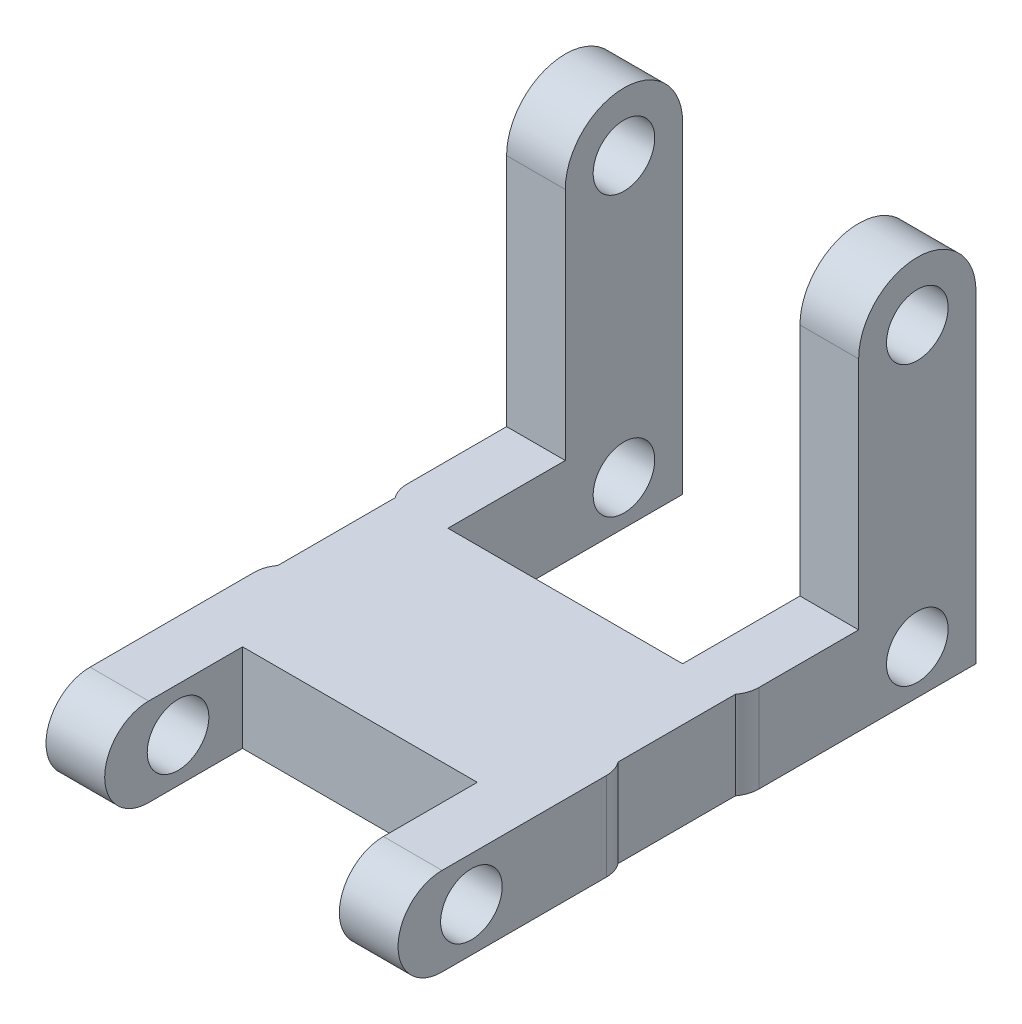
ISO-10303-21;
HEADER;
FILE_DESCRIPTION(('STEP AP214'),'2;1');
FILE_NAME('part.step','',(''),(''),'','','');
FILE_SCHEMA(('AUTOMOTIVE_DESIGN { 1 0 10303 214 1 1 1 1 }'));
ENDSEC;
DATA;
#1=APPLICATION_CONTEXT('core data for automotive mechanical design processes');
#2=APPLICATION_PROTOCOL_DEFINITION('international standard','automotive_design',2000,#1);
#3=PRODUCT_CONTEXT('',#1,'mechanical');
#4=PRODUCT('Part','Part','',(#3));
#5=PRODUCT_RELATED_PRODUCT_CATEGORY('part','',(#4));
#6=PRODUCT_DEFINITION_FORMATION('','',#4);
#7=PRODUCT_DEFINITION_CONTEXT('part definition',#1,'design');
#8=PRODUCT_DEFINITION('design','',#6,#7);
#9=PRODUCT_DEFINITION_SHAPE('','',#8);
#10=(LENGTH_UNIT() NAMED_UNIT(*) SI_UNIT(.MILLI.,.METRE.));
#11=(NAMED_UNIT(*) PLANE_ANGLE_UNIT() SI_UNIT($,.RADIAN.));
#12=(NAMED_UNIT(*) SI_UNIT($,.STERADIAN.) SOLID_ANGLE_UNIT());
#13=UNCERTAINTY_MEASURE_WITH_UNIT(LENGTH_MEASURE(1.E-05),#10,'distance_accuracy_value','');
#14=(GEOMETRIC_REPRESENTATION_CONTEXT(3) GLOBAL_UNCERTAINTY_ASSIGNED_CONTEXT((#13)) GLOBAL_UNIT_ASSIGNED_CONTEXT((#10,
#11,#12)) REPRESENTATION_CONTEXT('',''));
#15=CARTESIAN_POINT('',(0.,0.,0.));
#16=DIRECTION('',(0.,0.,1.));
#17=DIRECTION('',(1.,0.,0.));
#18=AXIS2_PLACEMENT_3D('',#15,#16,#17);
#19=CARTESIAN_POINT('',(-4.,3.,8.7));
#20=DIRECTION('',(-1.,0.,0.));
#21=DIRECTION('',(0.,0.,1.));
#22=AXIS2_PLACEMENT_3D('',#19,#20,#21);
#23=PLANE('',#22);
#24=CARTESIAN_POINT('',(-4.,1.5,5.2));
#25=DIRECTION('',(-1.,0.,0.));
#26=DIRECTION('',(0.,0.,1.));
#27=AXIS2_PLACEMENT_3D('',#24,#25,#26);
#28=CIRCLE('',#27,1.05);
#29=CARTESIAN_POINT('',(-4.,1.5,6.25));
#30=VERTEX_POINT('',#29);
#31=EDGE_CURVE('E282',#30,#30,#28,.T.);
#32=ORIENTED_EDGE('',*,*,#31,.T.);
#33=EDGE_LOOP('',(#32));
#34=FACE_BOUND('',#33,.T.);
#35=CARTESIAN_POINT('',(-4.,1.5,6.2));
#36=DIRECTION('',(-1.,0.,0.));
#37=DIRECTION('',(0.,0.,1.));
#38=AXIS2_PLACEMENT_3D('',#35,#36,#37);
#39=CIRCLE('',#38,1.5);
#40=CARTESIAN_POINT('',(-4.,0.,6.2));
#41=VERTEX_POINT('',#40);
#42=CARTESIAN_POINT('',(-4.,3.,6.2));
#43=VERTEX_POINT('',#42);
#44=EDGE_CURVE('E298',#41,#43,#39,.T.);
#45=ORIENTED_EDGE('',*,*,#44,.F.);
#46=DIRECTION('',(0.,0.,-1.));
#47=VECTOR('',#46,1.);
#48=CARTESIAN_POINT('',(-4.,0.,8.7));
#49=LINE('',#48,#47);
#50=CARTESIAN_POINT('',(-4.,0.,3.));
#51=VERTEX_POINT('',#50);
#52=EDGE_CURVE('E300',#41,#51,#49,.T.);
#53=ORIENTED_EDGE('',*,*,#52,.T.);
#54=DIRECTION('',(0.,-1.,0.));
#55=VECTOR('',#54,1.);
#56=CARTESIAN_POINT('',(-4.,3.,3.));
#57=LINE('',#56,#55);
#58=CARTESIAN_POINT('',(-4.,3.,3.));
#59=VERTEX_POINT('',#58);
#60=EDGE_CURVE('E327',#59,#51,#57,.T.);
#61=ORIENTED_EDGE('',*,*,#60,.F.);
#62=DIRECTION('',(0.,0.,-1.));
#63=VECTOR('',#62,1.);
#64=CARTESIAN_POINT('',(-4.,3.,8.7));
#65=LINE('',#64,#63);
#66=EDGE_CURVE('E301',#43,#59,#65,.T.);
#67=ORIENTED_EDGE('',*,*,#66,.F.);
#68=EDGE_LOOP('',(#45,#53,#61,#67));
#69=FACE_BOUND('',#68,.T.);
#70=ADVANCED_FACE('F35',(#34,#69),#23,.F.);
#71=CARTESIAN_POINT('',(4.,3.,3.));
#72=DIRECTION('',(1.,0.,0.));
#73=DIRECTION('',(0.,0.,-1.));
#74=AXIS2_PLACEMENT_3D('',#71,#72,#73);
#75=PLANE('',#74);
#76=CARTESIAN_POINT('',(4.,1.5,5.2));
#77=DIRECTION('',(1.,0.,0.));
#78=DIRECTION('',(0.,0.,-1.));
#79=AXIS2_PLACEMENT_3D('',#76,#77,#78);
#80=CIRCLE('',#79,1.05);
#81=CARTESIAN_POINT('',(4.,1.5,4.15));
#82=VERTEX_POINT('',#81);
#83=EDGE_CURVE('E277',#82,#82,#80,.T.);
#84=ORIENTED_EDGE('',*,*,#83,.T.);
#85=EDGE_LOOP('',(#84));
#86=FACE_BOUND('',#85,.T.);
#87=CARTESIAN_POINT('',(4.,1.5,6.2));
#88=DIRECTION('',(1.,0.,0.));
#89=DIRECTION('',(0.,0.,-1.));
#90=AXIS2_PLACEMENT_3D('',#87,#88,#89);
#91=CIRCLE('',#90,1.5);
#92=CARTESIAN_POINT('',(4.,3.,6.2));
#93=VERTEX_POINT('',#92);
#94=CARTESIAN_POINT('',(4.,0.,6.2));
#95=VERTEX_POINT('',#94);
#96=EDGE_CURVE('E294',#93,#95,#91,.T.);
#97=ORIENTED_EDGE('',*,*,#96,.F.);
#98=DIRECTION('',(0.,0.,1.));
#99=VECTOR('',#98,1.);
#100=CARTESIAN_POINT('',(4.,3.,3.));
#101=LINE('',#100,#99);
#102=CARTESIAN_POINT('',(4.,3.,3.));
#103=VERTEX_POINT('',#102);
#104=EDGE_CURVE('E306',#103,#93,#101,.T.);
#105=ORIENTED_EDGE('',*,*,#104,.F.);
#106=DIRECTION('',(0.,-1.,0.));
#107=VECTOR('',#106,1.);
#108=CARTESIAN_POINT('',(4.,3.,3.));
#109=LINE('',#108,#107);
#110=CARTESIAN_POINT('',(4.,0.,3.));
#111=VERTEX_POINT('',#110);
#112=EDGE_CURVE('E314',#103,#111,#109,.T.);
#113=ORIENTED_EDGE('',*,*,#112,.T.);
#114=DIRECTION('',(0.,0.,1.));
#115=VECTOR('',#114,1.);
#116=CARTESIAN_POINT('',(4.,0.,3.));
#117=LINE('',#116,#115);
#118=EDGE_CURVE('E318',#111,#95,#117,.T.);
#119=ORIENTED_EDGE('',*,*,#118,.T.);
#120=EDGE_LOOP('',(#97,#105,#113,#119));
#121=FACE_BOUND('',#120,.T.);
#122=ADVANCED_FACE('F453',(#86,#121),#75,.F.);
#123=CARTESIAN_POINT('',(6.,3.,8.7));
#124=DIRECTION('',(-1.,0.,0.));
#125=DIRECTION('',(0.,0.,1.));
#126=AXIS2_PLACEMENT_3D('',#123,#124,#125);
#127=PLANE('',#126);
#128=CARTESIAN_POINT('',(6.,1.5,5.2));
#129=DIRECTION('',(-1.,0.,0.));
#130=DIRECTION('',(0.,0.,1.));
#131=AXIS2_PLACEMENT_3D('',#128,#129,#130);
#132=CIRCLE('',#131,1.05);
#133=CARTESIAN_POINT('',(6.,1.5,6.25));
#134=VERTEX_POINT('',#133);
#135=EDGE_CURVE('E274',#134,#134,#132,.T.);
#136=ORIENTED_EDGE('',*,*,#135,.T.);
#137=EDGE_LOOP('',(#136));
#138=FACE_BOUND('',#137,.T.);
#139=DIRECTION('',(0.,0.,-1.));
#140=VECTOR('',#139,1.);
#141=CARTESIAN_POINT('',(6.,0.,8.7));
#142=LINE('',#141,#140);
#143=CARTESIAN_POINT('',(6.00000000000001,0.,6.2));
#144=VERTEX_POINT('',#143);
#145=CARTESIAN_POINT('',(6.,0.,0.599999999999996));
#146=VERTEX_POINT('',#145);
#147=EDGE_CURVE('E321',#144,#146,#142,.T.);
#148=ORIENTED_EDGE('',*,*,#147,.T.);
#149=DIRECTION('',(0.,-1.,0.));
#150=VECTOR('',#149,1.);
#151=CARTESIAN_POINT('',(6.,3.,0.599999999999996));
#152=LINE('',#151,#150);
#153=CARTESIAN_POINT('',(6.,3.,0.599999999999996));
#154=VERTEX_POINT('',#153);
#155=EDGE_CURVE('E341',#146,#154,#152,.F.);
#156=ORIENTED_EDGE('',*,*,#155,.T.);
#157=DIRECTION('',(0.,0.,-1.));
#158=VECTOR('',#157,1.);
#159=CARTESIAN_POINT('',(6.,3.,8.7));
#160=LINE('',#159,#158);
#161=CARTESIAN_POINT('',(6.00000000000001,3.,6.2));
#162=VERTEX_POINT('',#161);
#163=EDGE_CURVE('E309',#162,#154,#160,.T.);
#164=ORIENTED_EDGE('',*,*,#163,.F.);
#165=CARTESIAN_POINT('',(6.00000000000001,1.5,6.2));
#166=DIRECTION('',(-1.,0.,0.));
#167=DIRECTION('',(0.,0.,1.));
#168=AXIS2_PLACEMENT_3D('',#165,#166,#167);
#169=CIRCLE('',#168,1.5);
#170=EDGE_CURVE('E286',#144,#162,#169,.T.);
#171=ORIENTED_EDGE('',*,*,#170,.F.);
#172=EDGE_LOOP('',(#148,#156,#164,#171));
#173=FACE_BOUND('',#172,.T.);
#174=ADVANCED_FACE('F459',(#138,#173),#127,.F.);
#175=CARTESIAN_POINT('',(-6.,3.,0.));
#176=DIRECTION('',(1.,0.,0.));
#177=DIRECTION('',(0.,0.,-1.));
#178=AXIS2_PLACEMENT_3D('',#175,#176,#177);
#179=PLANE('',#178);
#180=CARTESIAN_POINT('',(-6.,1.5,5.2));
#181=DIRECTION('',(-1.,0.,0.));
#182=DIRECTION('',(0.,0.,1.));
#183=AXIS2_PLACEMENT_3D('',#180,#181,#182);
#184=CIRCLE('',#183,1.05);
#185=CARTESIAN_POINT('',(-6.,1.5,6.25));
#186=VERTEX_POINT('',#185);
#187=EDGE_CURVE('E273',#186,#186,#184,.T.);
#188=ORIENTED_EDGE('',*,*,#187,.F.);
#189=EDGE_LOOP('',(#188));
#190=FACE_BOUND('',#189,.T.);
#191=DIRECTION('',(0.,0.,1.));
#192=VECTOR('',#191,1.);
#193=CARTESIAN_POINT('',(-6.,3.,0.));
#194=LINE('',#193,#192);
#195=CARTESIAN_POINT('',(-6.,3.,0.6));
#196=VERTEX_POINT('',#195);
#197=CARTESIAN_POINT('',(-6.,3.,6.2));
#198=VERTEX_POINT('',#197);
#199=EDGE_CURVE('E312',#196,#198,#194,.T.);
#200=ORIENTED_EDGE('',*,*,#199,.F.);
#201=DIRECTION('',(0.,1.,0.));
#202=VECTOR('',#201,1.);
#203=CARTESIAN_POINT('',(-6.,3.,0.6));
#204=LINE('',#203,#202);
#205=CARTESIAN_POINT('',(-6.,0.,0.6));
#206=VERTEX_POINT('',#205);
#207=EDGE_CURVE('E347',#196,#206,#204,.F.);
#208=ORIENTED_EDGE('',*,*,#207,.T.);
#209=DIRECTION('',(0.,0.,1.));
#210=VECTOR('',#209,1.);
#211=CARTESIAN_POINT('',(-6.,0.,0.));
#212=LINE('',#211,#210);
#213=CARTESIAN_POINT('',(-6.,0.,6.2));
#214=VERTEX_POINT('',#213);
#215=EDGE_CURVE('E304',#206,#214,#212,.T.);
#216=ORIENTED_EDGE('',*,*,#215,.T.);
#217=CARTESIAN_POINT('',(-6.,1.5,6.2));
#218=DIRECTION('',(-1.,0.,0.));
#219=DIRECTION('',(0.,0.,1.));
#220=AXIS2_PLACEMENT_3D('',#217,#218,#219);
#221=CIRCLE('',#220,1.5);
#222=EDGE_CURVE('E285',#214,#198,#221,.T.);
#223=ORIENTED_EDGE('',*,*,#222,.T.);
#224=EDGE_LOOP('',(#200,#208,#216,#223));
#225=FACE_BOUND('',#224,.T.);
#226=ADVANCED_FACE('F482',(#190,#225),#179,.F.);
#227=CARTESIAN_POINT('',(0.,3.,0.));
#228=DIRECTION('',(0.,-1.,0.));
#229=DIRECTION('',(0.,0.,-1.));
#230=AXIS2_PLACEMENT_3D('',#227,#228,#229);
#231=PLANE('',#230);
#232=DIRECTION('',(0.,0.,1.));
#233=VECTOR('',#232,1.);
#234=CARTESIAN_POINT('',(-6.,3.,-12.));
#235=LINE('',#234,#233);
#236=CARTESIAN_POINT('',(-6.,3.,-8.));
#237=VERTEX_POINT('',#236);
#238=CARTESIAN_POINT('',(-6.,3.,-4.6));
#239=VERTEX_POINT('',#238);
#240=EDGE_CURVE('E263',#237,#239,#235,.T.);
#241=ORIENTED_EDGE('',*,*,#240,.T.);
#242=CARTESIAN_POINT('',(-5.,3.,-4.6));
#243=DIRECTION('',(0.,-1.,0.));
#244=DIRECTION('',(0.,0.,-1.));
#245=AXIS2_PLACEMENT_3D('',#242,#243,#244);
#246=CIRCLE('',#245,1.);
#247=CARTESIAN_POINT('',(-5.8,3.,-4.));
#248=VERTEX_POINT('',#247);
#249=EDGE_CURVE('E357',#239,#248,#246,.F.);
#250=ORIENTED_EDGE('',*,*,#249,.T.);
#251=DIRECTION('',(0.,0.,-1.));
#252=VECTOR('',#251,1.);
#253=CARTESIAN_POINT('',(-5.8,3.,11.9816526406001));
#254=LINE('',#253,#252);
#255=CARTESIAN_POINT('',(-5.8,3.,0.));
#256=VERTEX_POINT('',#255);
#257=EDGE_CURVE('E376',#256,#248,#254,.T.);
#258=ORIENTED_EDGE('',*,*,#257,.F.);
#259=CARTESIAN_POINT('',(-5.,3.,0.6));
#260=DIRECTION('',(0.,-1.,0.));
#261=DIRECTION('',(0.,0.,-1.));
#262=AXIS2_PLACEMENT_3D('',#259,#260,#261);
#263=CIRCLE('',#262,1.);
#264=EDGE_CURVE('E343',#256,#196,#263,.F.);
#265=ORIENTED_EDGE('',*,*,#264,.T.);
#266=ORIENTED_EDGE('',*,*,#199,.T.);
#267=DIRECTION('',(-1.,0.,0.));
#268=VECTOR('',#267,1.);
#269=CARTESIAN_POINT('',(6.00000000000001,3.,6.2));
#270=LINE('',#269,#268);
#271=EDGE_CURVE('E288',#43,#198,#270,.T.);
#272=ORIENTED_EDGE('',*,*,#271,.F.);
#273=ORIENTED_EDGE('',*,*,#66,.T.);
#274=DIRECTION('',(1.,0.,0.));
#275=VECTOR('',#274,1.);
#276=CARTESIAN_POINT('',(-4.,3.,3.));
#277=LINE('',#276,#275);
#278=EDGE_CURVE('E303',#59,#103,#277,.T.);
#279=ORIENTED_EDGE('',*,*,#278,.T.);
#280=ORIENTED_EDGE('',*,*,#104,.T.);
#281=EDGE_CURVE('E295',#162,#93,#270,.T.);
#282=ORIENTED_EDGE('',*,*,#281,.F.);
#283=ORIENTED_EDGE('',*,*,#163,.T.);
#284=CARTESIAN_POINT('',(5.,3.,0.599999999999996));
#285=DIRECTION('',(0.,-1.,0.));
#286=DIRECTION('',(0.,0.,-1.));
#287=AXIS2_PLACEMENT_3D('',#284,#285,#286);
#288=CIRCLE('',#287,1.);
#289=CARTESIAN_POINT('',(5.8,3.,0.));
#290=VERTEX_POINT('',#289);
#291=EDGE_CURVE('E345',#154,#290,#288,.F.);
#292=ORIENTED_EDGE('',*,*,#291,.T.);
#293=DIRECTION('',(0.,0.,-1.));
#294=VECTOR('',#293,1.);
#295=CARTESIAN_POINT('',(5.8,3.,11.9816526406001));
#296=LINE('',#295,#294);
#297=CARTESIAN_POINT('',(5.8,3.,-4.));
#298=VERTEX_POINT('',#297);
#299=EDGE_CURVE('E383',#290,#298,#296,.T.);
#300=ORIENTED_EDGE('',*,*,#299,.T.);
#301=CARTESIAN_POINT('',(5.00000000000001,3.,-4.60000000000001));
#302=DIRECTION('',(0.,-1.,0.));
#303=DIRECTION('',(0.,0.,-1.));
#304=AXIS2_PLACEMENT_3D('',#301,#302,#303);
#305=CIRCLE('',#304,1.);
#306=CARTESIAN_POINT('',(6.,3.,-4.60000000000001));
#307=VERTEX_POINT('',#306);
#308=EDGE_CURVE('E57',#298,#307,#305,.F.);
#309=ORIENTED_EDGE('',*,*,#308,.T.);
#310=DIRECTION('',(0.,0.,1.));
#311=VECTOR('',#310,1.);
#312=CARTESIAN_POINT('',(6.,3.,-12.));
#313=LINE('',#312,#311);
#314=CARTESIAN_POINT('',(6.,3.,-8.));
#315=VERTEX_POINT('',#314);
#316=EDGE_CURVE('E271',#315,#307,#313,.T.);
#317=ORIENTED_EDGE('',*,*,#316,.F.);
#318=DIRECTION('',(1.,0.,0.));
#319=VECTOR('',#318,1.);
#320=CARTESIAN_POINT('',(4.,3.,-8.));
#321=LINE('',#320,#319);
#322=CARTESIAN_POINT('',(4.,3.,-8.));
#323=VERTEX_POINT('',#322);
#324=EDGE_CURVE('E232',#323,#315,#321,.T.);
#325=ORIENTED_EDGE('',*,*,#324,.F.);
#326=DIRECTION('',(0.,0.,-1.));
#327=VECTOR('',#326,1.);
#328=CARTESIAN_POINT('',(4.,3.,-4.));
#329=LINE('',#328,#327);
#330=CARTESIAN_POINT('',(4.,3.,-4.));
#331=VERTEX_POINT('',#330);
#332=EDGE_CURVE('E428',#331,#323,#329,.T.);
#333=ORIENTED_EDGE('',*,*,#332,.F.);
#334=DIRECTION('',(1.,0.,0.));
#335=VECTOR('',#334,1.);
#336=CARTESIAN_POINT('',(-4.,3.,-4.));
#337=LINE('',#336,#335);
#338=CARTESIAN_POINT('',(-4.,3.,-4.));
#339=VERTEX_POINT('',#338);
#340=EDGE_CURVE('E205',#339,#331,#337,.T.);
#341=ORIENTED_EDGE('',*,*,#340,.F.);
#342=DIRECTION('',(0.,0.,1.));
#343=VECTOR('',#342,1.);
#344=CARTESIAN_POINT('',(-4.,3.,-8.));
#345=LINE('',#344,#343);
#346=CARTESIAN_POINT('',(-4.,3.,-8.));
#347=VERTEX_POINT('',#346);
#348=EDGE_CURVE('E197',#347,#339,#345,.T.);
#349=ORIENTED_EDGE('',*,*,#348,.F.);
#350=DIRECTION('',(-1.,0.,0.));
#351=VECTOR('',#350,1.);
#352=CARTESIAN_POINT('',(-4.,3.,-8.));
#353=LINE('',#352,#351);
#354=EDGE_CURVE('E201',#347,#237,#353,.T.);
#355=ORIENTED_EDGE('',*,*,#354,.T.);
#356=EDGE_LOOP('',(#241,#250,#258,#265,#266,#272,#273,#279,#280,#282,#283,#292,#300,#309,#317,
#325,#333,#341,#349,#355));
#357=FACE_BOUND('',#356,.T.);
#358=ADVANCED_FACE('F200',(#357),#231,.F.);
#359=CARTESIAN_POINT('',(0.,0.,0.));
#360=DIRECTION('',(0.,-1.,0.));
#361=DIRECTION('',(0.,0.,-1.));
#362=AXIS2_PLACEMENT_3D('',#359,#360,#361);
#363=PLANE('',#362);
#364=DIRECTION('',(0.,0.,-1.));
#365=VECTOR('',#364,1.);
#366=CARTESIAN_POINT('',(-5.8,0.,11.9816526406001));
#367=LINE('',#366,#365);
#368=CARTESIAN_POINT('',(-5.8,0.,0.));
#369=VERTEX_POINT('',#368);
#370=CARTESIAN_POINT('',(-5.8,0.,-4.));
#371=VERTEX_POINT('',#370);
#372=EDGE_CURVE('E366',#369,#371,#367,.T.);
#373=ORIENTED_EDGE('',*,*,#372,.T.);
#374=CARTESIAN_POINT('',(-5.,0.,-4.6));
#375=DIRECTION('',(0.,-1.,0.));
#376=DIRECTION('',(0.,0.,-1.));
#377=AXIS2_PLACEMENT_3D('',#374,#375,#376);
#378=CIRCLE('',#377,1.);
#379=CARTESIAN_POINT('',(-6.,0.,-4.6));
#380=VERTEX_POINT('',#379);
#381=EDGE_CURVE('E43',#371,#380,#378,.T.);
#382=ORIENTED_EDGE('',*,*,#381,.T.);
#383=DIRECTION('',(0.,0.,1.));
#384=VECTOR('',#383,1.);
#385=CARTESIAN_POINT('',(-6.,0.,-12.));
#386=LINE('',#385,#384);
#387=CARTESIAN_POINT('',(-6.,0.,-12.));
#388=VERTEX_POINT('',#387);
#389=EDGE_CURVE('E265',#388,#380,#386,.T.);
#390=ORIENTED_EDGE('',*,*,#389,.F.);
#391=DIRECTION('',(-1.,0.,0.));
#392=VECTOR('',#391,1.);
#393=CARTESIAN_POINT('',(6.00000000000001,0.,-12.));
#394=LINE('',#393,#392);
#395=CARTESIAN_POINT('',(-4.,0.,-12.));
#396=VERTEX_POINT('',#395);
#397=EDGE_CURVE('E257',#396,#388,#394,.T.);
#398=ORIENTED_EDGE('',*,*,#397,.F.);
#399=DIRECTION('',(0.,0.,1.));
#400=VECTOR('',#399,1.);
#401=CARTESIAN_POINT('',(-4.,0.,-12.));
#402=LINE('',#401,#400);
#403=CARTESIAN_POINT('',(-4.,0.,-4.));
#404=VERTEX_POINT('',#403);
#405=EDGE_CURVE('E247',#396,#404,#402,.T.);
#406=ORIENTED_EDGE('',*,*,#405,.T.);
#407=DIRECTION('',(-1.,0.,0.));
#408=VECTOR('',#407,1.);
#409=CARTESIAN_POINT('',(0.,0.,-4.));
#410=LINE('',#409,#408);
#411=CARTESIAN_POINT('',(4.,0.,-4.));
#412=VERTEX_POINT('',#411);
#413=EDGE_CURVE('E350',#412,#404,#410,.T.);
#414=ORIENTED_EDGE('',*,*,#413,.F.);
#415=DIRECTION('',(0.,0.,-1.));
#416=VECTOR('',#415,1.);
#417=CARTESIAN_POINT('',(4.,0.,-12.));
#418=LINE('',#417,#416);
#419=CARTESIAN_POINT('',(4.,0.,-12.));
#420=VERTEX_POINT('',#419);
#421=EDGE_CURVE('E243',#412,#420,#418,.T.);
#422=ORIENTED_EDGE('',*,*,#421,.T.);
#423=CARTESIAN_POINT('',(6.00000000000001,0.,-12.));
#424=VERTEX_POINT('',#423);
#425=EDGE_CURVE('E258',#424,#420,#394,.T.);
#426=ORIENTED_EDGE('',*,*,#425,.F.);
#427=DIRECTION('',(0.,0.,1.));
#428=VECTOR('',#427,1.);
#429=CARTESIAN_POINT('',(6.00000000000001,0.,-12.));
#430=LINE('',#429,#428);
#431=CARTESIAN_POINT('',(6.00000000000001,0.,-4.60000000000001));
#432=VERTEX_POINT('',#431);
#433=EDGE_CURVE('E268',#424,#432,#430,.T.);
#434=ORIENTED_EDGE('',*,*,#433,.T.);
#435=CARTESIAN_POINT('',(5.00000000000001,0.,-4.60000000000001));
#436=DIRECTION('',(0.,-1.,0.));
#437=DIRECTION('',(0.,0.,-1.));
#438=AXIS2_PLACEMENT_3D('',#435,#436,#437);
#439=CIRCLE('',#438,1.);
#440=CARTESIAN_POINT('',(5.8,0.,-4.));
#441=VERTEX_POINT('',#440);
#442=EDGE_CURVE('E50',#432,#441,#439,.T.);
#443=ORIENTED_EDGE('',*,*,#442,.T.);
#444=DIRECTION('',(0.,0.,-1.));
#445=VECTOR('',#444,1.);
#446=CARTESIAN_POINT('',(5.8,0.,11.9816526406001));
#447=LINE('',#446,#445);
#448=CARTESIAN_POINT('',(5.8,0.,0.));
#449=VERTEX_POINT('',#448);
#450=EDGE_CURVE('E391',#449,#441,#447,.T.);
#451=ORIENTED_EDGE('',*,*,#450,.F.);
#452=CARTESIAN_POINT('',(5.,0.,0.599999999999996));
#453=DIRECTION('',(0.,-1.,0.));
#454=DIRECTION('',(0.,0.,-1.));
#455=AXIS2_PLACEMENT_3D('',#452,#453,#454);
#456=CIRCLE('',#455,1.);
#457=EDGE_CURVE('E339',#449,#146,#456,.T.);
#458=ORIENTED_EDGE('',*,*,#457,.T.);
#459=ORIENTED_EDGE('',*,*,#147,.F.);
#460=DIRECTION('',(-1.,0.,0.));
#461=VECTOR('',#460,1.);
#462=CARTESIAN_POINT('',(6.00000000000001,0.,6.2));
#463=LINE('',#462,#461);
#464=EDGE_CURVE('E291',#144,#95,#463,.T.);
#465=ORIENTED_EDGE('',*,*,#464,.T.);
#466=ORIENTED_EDGE('',*,*,#118,.F.);
#467=DIRECTION('',(1.,0.,0.));
#468=VECTOR('',#467,1.);
#469=CARTESIAN_POINT('',(-4.,0.,3.));
#470=LINE('',#469,#468);
#471=EDGE_CURVE('E316',#51,#111,#470,.T.);
#472=ORIENTED_EDGE('',*,*,#471,.F.);
#473=ORIENTED_EDGE('',*,*,#52,.F.);
#474=DIRECTION('',(-1.,0.,0.));
#475=VECTOR('',#474,1.);
#476=CARTESIAN_POINT('',(6.00000000000001,0.,6.2));
#477=LINE('',#476,#475);
#478=EDGE_CURVE('E330',#41,#214,#477,.T.);
#479=ORIENTED_EDGE('',*,*,#478,.T.);
#480=ORIENTED_EDGE('',*,*,#215,.F.);
#481=CARTESIAN_POINT('',(-5.,0.,0.6));
#482=DIRECTION('',(0.,-1.,0.));
#483=DIRECTION('',(0.,0.,-1.));
#484=AXIS2_PLACEMENT_3D('',#481,#482,#483);
#485=CIRCLE('',#484,1.);
#486=EDGE_CURVE('E333',#206,#369,#485,.T.);
#487=ORIENTED_EDGE('',*,*,#486,.T.);
#488=EDGE_LOOP('',(#373,#382,#390,#398,#406,#414,#422,#426,#434,#443,#451,#458,#459,#465,#466,
#472,#473,#479,#480,#487));
#489=FACE_BOUND('',#488,.T.);
#490=ADVANCED_FACE('F362',(#489),#363,.T.);
#491=CARTESIAN_POINT('',(-4.,3.,3.));
#492=DIRECTION('',(0.,0.,-1.));
#493=DIRECTION('',(-1.,0.,0.));
#494=AXIS2_PLACEMENT_3D('',#491,#492,#493);
#495=PLANE('',#494);
#496=ORIENTED_EDGE('',*,*,#471,.T.);
#497=ORIENTED_EDGE('',*,*,#112,.F.);
#498=ORIENTED_EDGE('',*,*,#278,.F.);
#499=ORIENTED_EDGE('',*,*,#60,.T.);
#500=EDGE_LOOP('',(#496,#497,#498,#499));
#501=FACE_BOUND('',#500,.T.);
#502=ADVANCED_FACE('F465',(#501),#495,.F.);
#503=CARTESIAN_POINT('',(6.00000000000001,1.5,6.2));
#504=DIRECTION('',(-1.,0.,0.));
#505=DIRECTION('',(0.,0.,1.));
#506=AXIS2_PLACEMENT_3D('',#503,#504,#505);
#507=CYLINDRICAL_SURFACE('',#506,1.5);
#508=ORIENTED_EDGE('',*,*,#44,.T.);
#509=ORIENTED_EDGE('',*,*,#271,.T.);
#510=ORIENTED_EDGE('',*,*,#222,.F.);
#511=ORIENTED_EDGE('',*,*,#478,.F.);
#512=EDGE_LOOP('',(#508,#509,#510,#511));
#513=FACE_BOUND('',#512,.T.);
#514=ADVANCED_FACE('F486',(#513),#507,.T.);
#515=ORIENTED_EDGE('',*,*,#96,.T.);
#516=ORIENTED_EDGE('',*,*,#464,.F.);
#517=ORIENTED_EDGE('',*,*,#170,.T.);
#518=ORIENTED_EDGE('',*,*,#281,.T.);
#519=EDGE_LOOP('',(#515,#516,#517,#518));
#520=FACE_BOUND('',#519,.T.);
#521=ADVANCED_FACE('F507',(#520),#507,.T.);
#522=CARTESIAN_POINT('',(6.,1.5,5.2));
#523=DIRECTION('',(-1.,0.,0.));
#524=DIRECTION('',(0.,0.,1.));
#525=AXIS2_PLACEMENT_3D('',#522,#523,#524);
#526=CYLINDRICAL_SURFACE('',#525,1.05);
#527=ORIENTED_EDGE('',*,*,#187,.T.);
#528=EDGE_LOOP('',(#527));
#529=FACE_BOUND('',#528,.T.);
#530=ORIENTED_EDGE('',*,*,#31,.F.);
#531=EDGE_LOOP('',(#530));
#532=FACE_BOUND('',#531,.T.);
#533=ADVANCED_FACE('F509',(#529,#532),#526,.F.);
#534=ORIENTED_EDGE('',*,*,#135,.F.);
#535=EDGE_LOOP('',(#534));
#536=FACE_BOUND('',#535,.T.);
#537=ORIENTED_EDGE('',*,*,#83,.F.);
#538=EDGE_LOOP('',(#537));
#539=FACE_BOUND('',#538,.T.);
#540=ADVANCED_FACE('F515',(#536,#539),#526,.F.);
#541=CARTESIAN_POINT('',(5.8,3.,11.9816526406001));
#542=DIRECTION('',(-1.,0.,0.));
#543=DIRECTION('',(0.,0.,1.));
#544=AXIS2_PLACEMENT_3D('',#541,#542,#543);
#545=PLANE('',#544);
#546=DIRECTION('',(0.,1.,0.));
#547=VECTOR('',#546,1.);
#548=CARTESIAN_POINT('',(5.8,3.,0.));
#549=LINE('',#548,#547);
#550=EDGE_CURVE('E402',#449,#290,#549,.T.);
#551=ORIENTED_EDGE('',*,*,#550,.F.);
#552=ORIENTED_EDGE('',*,*,#450,.T.);
#553=DIRECTION('',(0.,1.,0.));
#554=VECTOR('',#553,1.);
#555=CARTESIAN_POINT('',(5.8,3.,-4.));
#556=LINE('',#555,#554);
#557=EDGE_CURVE('E386',#441,#298,#556,.T.);
#558=ORIENTED_EDGE('',*,*,#557,.T.);
#559=ORIENTED_EDGE('',*,*,#299,.F.);
#560=EDGE_LOOP('',(#551,#552,#558,#559));
#561=FACE_BOUND('',#560,.T.);
#562=ADVANCED_FACE('F441',(#561),#545,.F.);
#563=CARTESIAN_POINT('',(-5.8,0.,11.9816526406001));
#564=DIRECTION('',(1.,0.,0.));
#565=DIRECTION('',(0.,1.,0.));
#566=AXIS2_PLACEMENT_3D('',#563,#564,#565);
#567=PLANE('',#566);
#568=DIRECTION('',(0.,-1.,0.));
#569=VECTOR('',#568,1.);
#570=CARTESIAN_POINT('',(-5.8,0.,0.));
#571=LINE('',#570,#569);
#572=EDGE_CURVE('E381',#256,#369,#571,.T.);
#573=ORIENTED_EDGE('',*,*,#572,.F.);
#574=ORIENTED_EDGE('',*,*,#257,.T.);
#575=DIRECTION('',(0.,-1.,0.));
#576=VECTOR('',#575,1.);
#577=CARTESIAN_POINT('',(-5.8,0.,-4.));
#578=LINE('',#577,#576);
#579=EDGE_CURVE('E374',#248,#371,#578,.T.);
#580=ORIENTED_EDGE('',*,*,#579,.T.);
#581=ORIENTED_EDGE('',*,*,#372,.F.);
#582=EDGE_LOOP('',(#573,#574,#580,#581));
#583=FACE_BOUND('',#582,.T.);
#584=ADVANCED_FACE('F379',(#583),#567,.F.);
#585=CARTESIAN_POINT('',(-6.,1.49999999999998,-10.));
#586=DIRECTION('',(1.,0.,0.));
#587=DIRECTION('',(0.,1.,0.));
#588=AXIS2_PLACEMENT_3D('',#585,#586,#587);
#589=CYLINDRICAL_SURFACE('',#588,1.05);
#590=CARTESIAN_POINT('',(4.,1.5,-10.));
#591=DIRECTION('',(1.,0.,0.));
#592=DIRECTION('',(0.,0.,-1.));
#593=AXIS2_PLACEMENT_3D('',#590,#591,#592);
#594=CIRCLE('',#593,1.05);
#595=CARTESIAN_POINT('',(4.,1.5,-11.05));
#596=VERTEX_POINT('',#595);
#597=EDGE_CURVE('E241',#596,#596,#594,.F.);
#598=ORIENTED_EDGE('',*,*,#597,.T.);
#599=EDGE_LOOP('',(#598));
#600=FACE_BOUND('',#599,.T.);
#601=CARTESIAN_POINT('',(6.,1.5,-10.));
#602=DIRECTION('',(1.,0.,0.));
#603=DIRECTION('',(0.,1.,0.));
#604=AXIS2_PLACEMENT_3D('',#601,#602,#603);
#605=CIRCLE('',#604,1.05);
#606=CARTESIAN_POINT('',(6.,2.55,-10.));
#607=VERTEX_POINT('',#606);
#608=EDGE_CURVE('E249',#607,#607,#605,.T.);
#609=ORIENTED_EDGE('',*,*,#608,.T.);
#610=EDGE_LOOP('',(#609));
#611=FACE_BOUND('',#610,.T.);
#612=ADVANCED_FACE('F543',(#600,#611),#589,.F.);
#613=CARTESIAN_POINT('',(4.,11.,-10.));
#614=DIRECTION('',(1.,0.,0.));
#615=DIRECTION('',(0.,0.,-1.));
#616=AXIS2_PLACEMENT_3D('',#613,#614,#615);
#617=CYLINDRICAL_SURFACE('',#616,2.);
#618=CARTESIAN_POINT('',(6.,11.,-10.));
#619=DIRECTION('',(-1.,0.,0.));
#620=DIRECTION('',(0.,0.,1.));
#621=AXIS2_PLACEMENT_3D('',#618,#619,#620);
#622=CIRCLE('',#621,2.);
#623=CARTESIAN_POINT('',(6.,11.,-8.));
#624=VERTEX_POINT('',#623);
#625=CARTESIAN_POINT('',(6.,11.,-12.));
#626=VERTEX_POINT('',#625);
#627=EDGE_CURVE('E399',#624,#626,#622,.T.);
#628=ORIENTED_EDGE('',*,*,#627,.T.);
#629=DIRECTION('',(1.,0.,0.));
#630=VECTOR('',#629,1.);
#631=CARTESIAN_POINT('',(4.,11.,-12.));
#632=LINE('',#631,#630);
#633=CARTESIAN_POINT('',(4.,11.,-12.));
#634=VERTEX_POINT('',#633);
#635=EDGE_CURVE('E229',#634,#626,#632,.T.);
#636=ORIENTED_EDGE('',*,*,#635,.F.);
#637=CARTESIAN_POINT('',(4.,11.,-10.));
#638=DIRECTION('',(-1.,0.,0.));
#639=DIRECTION('',(0.,0.,1.));
#640=AXIS2_PLACEMENT_3D('',#637,#638,#639);
#641=CIRCLE('',#640,2.);
#642=CARTESIAN_POINT('',(4.,11.,-8.));
#643=VERTEX_POINT('',#642);
#644=EDGE_CURVE('E393',#643,#634,#641,.T.);
#645=ORIENTED_EDGE('',*,*,#644,.F.);
#646=DIRECTION('',(1.,0.,0.));
#647=VECTOR('',#646,1.);
#648=CARTESIAN_POINT('',(4.,11.,-8.));
#649=LINE('',#648,#647);
#650=EDGE_CURVE('E404',#643,#624,#649,.T.);
#651=ORIENTED_EDGE('',*,*,#650,.T.);
#652=EDGE_LOOP('',(#628,#636,#645,#651));
#653=FACE_BOUND('',#652,.T.);
#654=ADVANCED_FACE('F415',(#653),#617,.T.);
#655=CARTESIAN_POINT('',(-4.,11.,-10.));
#656=DIRECTION('',(-1.,0.,0.));
#657=DIRECTION('',(0.,0.,1.));
#658=AXIS2_PLACEMENT_3D('',#655,#656,#657);
#659=CYLINDRICAL_SURFACE('',#658,2.);
#660=CARTESIAN_POINT('',(-6.,11.,-10.));
#661=DIRECTION('',(-1.,0.,0.));
#662=DIRECTION('',(0.,0.,1.));
#663=AXIS2_PLACEMENT_3D('',#660,#661,#662);
#664=CIRCLE('',#663,2.);
#665=CARTESIAN_POINT('',(-6.,11.,-8.));
#666=VERTEX_POINT('',#665);
#667=CARTESIAN_POINT('',(-6.,11.,-12.));
#668=VERTEX_POINT('',#667);
#669=EDGE_CURVE('E223',#666,#668,#664,.T.);
#670=ORIENTED_EDGE('',*,*,#669,.F.);
#671=DIRECTION('',(-1.,0.,0.));
#672=VECTOR('',#671,1.);
#673=CARTESIAN_POINT('',(-4.,11.,-8.));
#674=LINE('',#673,#672);
#675=CARTESIAN_POINT('',(-4.,11.,-8.));
#676=VERTEX_POINT('',#675);
#677=EDGE_CURVE('E218',#676,#666,#674,.T.);
#678=ORIENTED_EDGE('',*,*,#677,.F.);
#679=CARTESIAN_POINT('',(-4.,11.,-10.));
#680=DIRECTION('',(-1.,0.,0.));
#681=DIRECTION('',(0.,0.,1.));
#682=AXIS2_PLACEMENT_3D('',#679,#680,#681);
#683=CIRCLE('',#682,2.);
#684=CARTESIAN_POINT('',(-4.,11.,-12.));
#685=VERTEX_POINT('',#684);
#686=EDGE_CURVE('E219',#676,#685,#683,.T.);
#687=ORIENTED_EDGE('',*,*,#686,.T.);
#688=DIRECTION('',(-1.,0.,0.));
#689=VECTOR('',#688,1.);
#690=CARTESIAN_POINT('',(-4.,11.,-12.));
#691=LINE('',#690,#689);
#692=EDGE_CURVE('E234',#685,#668,#691,.T.);
#693=ORIENTED_EDGE('',*,*,#692,.T.);
#694=EDGE_LOOP('',(#670,#678,#687,#693));
#695=FACE_BOUND('',#694,.T.);
#696=ADVANCED_FACE('F552',(#695),#659,.T.);
#697=CARTESIAN_POINT('',(-4.,1.49999999999998,-10.));
#698=DIRECTION('',(-1.,0.,0.));
#699=DIRECTION('',(0.,0.,1.));
#700=AXIS2_PLACEMENT_3D('',#697,#698,#699);
#701=CIRCLE('',#700,1.05);
#702=CARTESIAN_POINT('',(-4.,1.49999999999998,-8.95));
#703=VERTEX_POINT('',#702);
#704=EDGE_CURVE('E246',#703,#703,#701,.F.);
#705=ORIENTED_EDGE('',*,*,#704,.T.);
#706=EDGE_LOOP('',(#705));
#707=FACE_BOUND('',#706,.T.);
#708=CARTESIAN_POINT('',(-6.,1.49999999999998,-10.));
#709=DIRECTION('',(1.,0.,0.));
#710=DIRECTION('',(0.,1.,0.));
#711=AXIS2_PLACEMENT_3D('',#708,#709,#710);
#712=CIRCLE('',#711,1.05);
#713=CARTESIAN_POINT('',(-6.,2.54999999999998,-10.));
#714=VERTEX_POINT('',#713);
#715=EDGE_CURVE('E250',#714,#714,#712,.T.);
#716=ORIENTED_EDGE('',*,*,#715,.F.);
#717=EDGE_LOOP('',(#716));
#718=FACE_BOUND('',#717,.T.);
#719=ADVANCED_FACE('F555',(#707,#718),#589,.F.);
#720=CARTESIAN_POINT('',(0.,0.,-12.));
#721=DIRECTION('',(0.,0.,-1.));
#722=DIRECTION('',(-1.,0.,0.));
#723=AXIS2_PLACEMENT_3D('',#720,#721,#722);
#724=PLANE('',#723);
#725=DIRECTION('',(0.,1.,0.));
#726=VECTOR('',#725,1.);
#727=CARTESIAN_POINT('',(4.,-5.,-12.));
#728=LINE('',#727,#726);
#729=EDGE_CURVE('E237',#420,#634,#728,.T.);
#730=ORIENTED_EDGE('',*,*,#729,.T.);
#731=ORIENTED_EDGE('',*,*,#635,.T.);
#732=DIRECTION('',(0.,-1.,0.));
#733=VECTOR('',#732,1.);
#734=CARTESIAN_POINT('',(6.,3.,-12.));
#735=LINE('',#734,#733);
#736=EDGE_CURVE('E253',#626,#424,#735,.T.);
#737=ORIENTED_EDGE('',*,*,#736,.T.);
#738=ORIENTED_EDGE('',*,*,#425,.T.);
#739=EDGE_LOOP('',(#730,#731,#737,#738));
#740=FACE_BOUND('',#739,.T.);
#741=ADVANCED_FACE('F413',(#740),#724,.T.);
#742=CARTESIAN_POINT('',(4.,-5.,-12.));
#743=DIRECTION('',(1.,0.,0.));
#744=DIRECTION('',(0.,0.,-1.));
#745=AXIS2_PLACEMENT_3D('',#742,#743,#744);
#746=PLANE('',#745);
#747=CARTESIAN_POINT('',(4.,11.,-10.));
#748=DIRECTION('',(1.,0.,0.));
#749=DIRECTION('',(0.,0.,-1.));
#750=AXIS2_PLACEMENT_3D('',#747,#748,#749);
#751=CIRCLE('',#750,1.05);
#752=CARTESIAN_POINT('',(4.,11.,-11.05));
#753=VERTEX_POINT('',#752);
#754=EDGE_CURVE('E209',#753,#753,#751,.T.);
#755=ORIENTED_EDGE('',*,*,#754,.T.);
#756=EDGE_LOOP('',(#755));
#757=FACE_BOUND('',#756,.T.);
#758=ORIENTED_EDGE('',*,*,#597,.F.);
#759=EDGE_LOOP('',(#758));
#760=FACE_BOUND('',#759,.T.);
#761=ORIENTED_EDGE('',*,*,#421,.F.);
#762=DIRECTION('',(0.,1.,0.));
#763=VECTOR('',#762,1.);
#764=CARTESIAN_POINT('',(4.,-7.,-4.));
#765=LINE('',#764,#763);
#766=EDGE_CURVE('E392',#412,#331,#765,.T.);
#767=ORIENTED_EDGE('',*,*,#766,.T.);
#768=ORIENTED_EDGE('',*,*,#332,.T.);
#769=DIRECTION('',(0.,1.,0.));
#770=VECTOR('',#769,1.);
#771=CARTESIAN_POINT('',(4.,3.,-8.));
#772=LINE('',#771,#770);
#773=EDGE_CURVE('E396',#323,#643,#772,.T.);
#774=ORIENTED_EDGE('',*,*,#773,.T.);
#775=ORIENTED_EDGE('',*,*,#644,.T.);
#776=ORIENTED_EDGE('',*,*,#729,.F.);
#777=EDGE_LOOP('',(#761,#767,#768,#774,#775,#776));
#778=FACE_BOUND('',#777,.T.);
#779=ADVANCED_FACE('F423',(#757,#760,#778),#746,.F.);
#780=CARTESIAN_POINT('',(-4.,-5.,-12.));
#781=DIRECTION('',(-1.,0.,0.));
#782=DIRECTION('',(0.,0.,1.));
#783=AXIS2_PLACEMENT_3D('',#780,#781,#782);
#784=PLANE('',#783);
#785=CARTESIAN_POINT('',(-4.,11.,-10.));
#786=DIRECTION('',(-1.,0.,0.));
#787=DIRECTION('',(0.,0.,1.));
#788=AXIS2_PLACEMENT_3D('',#785,#786,#787);
#789=CIRCLE('',#788,1.05);
#790=CARTESIAN_POINT('',(-4.,11.,-8.95));
#791=VERTEX_POINT('',#790);
#792=EDGE_CURVE('E586',#791,#791,#789,.T.);
#793=ORIENTED_EDGE('',*,*,#792,.T.);
#794=EDGE_LOOP('',(#793));
#795=FACE_BOUND('',#794,.T.);
#796=ORIENTED_EDGE('',*,*,#704,.F.);
#797=EDGE_LOOP('',(#796));
#798=FACE_BOUND('',#797,.T.);
#799=DIRECTION('',(0.,1.,0.));
#800=VECTOR('',#799,1.);
#801=CARTESIAN_POINT('',(-4.,-5.,-12.));
#802=LINE('',#801,#800);
#803=EDGE_CURVE('E239',#396,#685,#802,.T.);
#804=ORIENTED_EDGE('',*,*,#803,.T.);
#805=ORIENTED_EDGE('',*,*,#686,.F.);
#806=DIRECTION('',(0.,1.,0.));
#807=VECTOR('',#806,1.);
#808=CARTESIAN_POINT('',(-4.,3.,-8.));
#809=LINE('',#808,#807);
#810=EDGE_CURVE('E214',#347,#676,#809,.T.);
#811=ORIENTED_EDGE('',*,*,#810,.F.);
#812=ORIENTED_EDGE('',*,*,#348,.T.);
#813=DIRECTION('',(0.,1.,0.));
#814=VECTOR('',#813,1.);
#815=CARTESIAN_POINT('',(-4.,-7.,-4.));
#816=LINE('',#815,#814);
#817=EDGE_CURVE('E426',#404,#339,#816,.T.);
#818=ORIENTED_EDGE('',*,*,#817,.F.);
#819=ORIENTED_EDGE('',*,*,#405,.F.);
#820=EDGE_LOOP('',(#804,#805,#811,#812,#818,#819));
#821=FACE_BOUND('',#820,.T.);
#822=ADVANCED_FACE('F221',(#795,#798,#821),#784,.F.);
#823=ORIENTED_EDGE('',*,*,#803,.F.);
#824=ORIENTED_EDGE('',*,*,#397,.T.);
#825=DIRECTION('',(0.,1.,0.));
#826=VECTOR('',#825,1.);
#827=CARTESIAN_POINT('',(-6.,3.,-12.));
#828=LINE('',#827,#826);
#829=EDGE_CURVE('E261',#388,#668,#828,.T.);
#830=ORIENTED_EDGE('',*,*,#829,.T.);
#831=ORIENTED_EDGE('',*,*,#692,.F.);
#832=EDGE_LOOP('',(#823,#824,#830,#831));
#833=FACE_BOUND('',#832,.T.);
#834=ADVANCED_FACE('F564',(#833),#724,.T.);
#835=CARTESIAN_POINT('',(6.,3.,-12.));
#836=DIRECTION('',(-1.,0.,0.));
#837=DIRECTION('',(0.,-1.,0.));
#838=AXIS2_PLACEMENT_3D('',#835,#836,#837);
#839=PLANE('',#838);
#840=CARTESIAN_POINT('',(6.,11.,-10.));
#841=DIRECTION('',(-1.,0.,0.));
#842=DIRECTION('',(0.,0.,1.));
#843=AXIS2_PLACEMENT_3D('',#840,#841,#842);
#844=CIRCLE('',#843,1.05);
#845=CARTESIAN_POINT('',(6.,11.,-8.95));
#846=VERTEX_POINT('',#845);
#847=EDGE_CURVE('E582',#846,#846,#844,.T.);
#848=ORIENTED_EDGE('',*,*,#847,.T.);
#849=EDGE_LOOP('',(#848));
#850=FACE_BOUND('',#849,.T.);
#851=ORIENTED_EDGE('',*,*,#608,.F.);
#852=EDGE_LOOP('',(#851));
#853=FACE_BOUND('',#852,.T.);
#854=ORIENTED_EDGE('',*,*,#316,.T.);
#855=DIRECTION('',(0.,1.,0.));
#856=VECTOR('',#855,1.);
#857=CARTESIAN_POINT('',(6.,3.,-4.60000000000001));
#858=LINE('',#857,#856);
#859=EDGE_CURVE('E12',#307,#432,#858,.F.);
#860=ORIENTED_EDGE('',*,*,#859,.T.);
#861=ORIENTED_EDGE('',*,*,#433,.F.);
#862=ORIENTED_EDGE('',*,*,#736,.F.);
#863=ORIENTED_EDGE('',*,*,#627,.F.);
#864=DIRECTION('',(0.,1.,0.));
#865=VECTOR('',#864,1.);
#866=CARTESIAN_POINT('',(6.,3.,-8.));
#867=LINE('',#866,#865);
#868=EDGE_CURVE('E397',#315,#624,#867,.T.);
#869=ORIENTED_EDGE('',*,*,#868,.F.);
#870=EDGE_LOOP('',(#854,#860,#861,#862,#863,#869));
#871=FACE_BOUND('',#870,.T.);
#872=ADVANCED_FACE('F418',(#850,#853,#871),#839,.F.);
#873=CARTESIAN_POINT('',(-4.,3.,-8.));
#874=DIRECTION('',(0.,0.,1.));
#875=DIRECTION('',(1.,0.,0.));
#876=AXIS2_PLACEMENT_3D('',#873,#874,#875);
#877=PLANE('',#876);
#878=DIRECTION('',(0.,1.,0.));
#879=VECTOR('',#878,1.);
#880=CARTESIAN_POINT('',(-6.,3.,-8.));
#881=LINE('',#880,#879);
#882=EDGE_CURVE('E217',#237,#666,#881,.T.);
#883=ORIENTED_EDGE('',*,*,#882,.F.);
#884=ORIENTED_EDGE('',*,*,#354,.F.);
#885=ORIENTED_EDGE('',*,*,#810,.T.);
#886=ORIENTED_EDGE('',*,*,#677,.T.);
#887=EDGE_LOOP('',(#883,#884,#885,#886));
#888=FACE_BOUND('',#887,.T.);
#889=ADVANCED_FACE('F213',(#888),#877,.T.);
#890=CARTESIAN_POINT('',(4.,3.,-8.));
#891=DIRECTION('',(0.,0.,-1.));
#892=DIRECTION('',(-1.,0.,0.));
#893=AXIS2_PLACEMENT_3D('',#890,#891,#892);
#894=PLANE('',#893);
#895=ORIENTED_EDGE('',*,*,#868,.T.);
#896=ORIENTED_EDGE('',*,*,#650,.F.);
#897=ORIENTED_EDGE('',*,*,#773,.F.);
#898=ORIENTED_EDGE('',*,*,#324,.T.);
#899=EDGE_LOOP('',(#895,#896,#897,#898));
#900=FACE_BOUND('',#899,.T.);
#901=ADVANCED_FACE('F546',(#900),#894,.F.);
#902=CARTESIAN_POINT('',(-6.,3.,-12.));
#903=DIRECTION('',(1.,0.,0.));
#904=DIRECTION('',(0.,0.,-1.));
#905=AXIS2_PLACEMENT_3D('',#902,#903,#904);
#906=PLANE('',#905);
#907=CARTESIAN_POINT('',(-6.,11.,-10.));
#908=DIRECTION('',(-1.,0.,0.));
#909=DIRECTION('',(0.,0.,1.));
#910=AXIS2_PLACEMENT_3D('',#907,#908,#909);
#911=CIRCLE('',#910,1.05);
#912=CARTESIAN_POINT('',(-6.,11.,-8.95));
#913=VERTEX_POINT('',#912);
#914=EDGE_CURVE('E587',#913,#913,#911,.T.);
#915=ORIENTED_EDGE('',*,*,#914,.F.);
#916=EDGE_LOOP('',(#915));
#917=FACE_BOUND('',#916,.T.);
#918=ORIENTED_EDGE('',*,*,#715,.T.);
#919=EDGE_LOOP('',(#918));
#920=FACE_BOUND('',#919,.T.);
#921=ORIENTED_EDGE('',*,*,#389,.T.);
#922=DIRECTION('',(0.,-1.,0.));
#923=VECTOR('',#922,1.);
#924=CARTESIAN_POINT('',(-6.,3.,-4.6));
#925=LINE('',#924,#923);
#926=EDGE_CURVE('E353',#380,#239,#925,.F.);
#927=ORIENTED_EDGE('',*,*,#926,.T.);
#928=ORIENTED_EDGE('',*,*,#240,.F.);
#929=ORIENTED_EDGE('',*,*,#882,.T.);
#930=ORIENTED_EDGE('',*,*,#669,.T.);
#931=ORIENTED_EDGE('',*,*,#829,.F.);
#932=EDGE_LOOP('',(#921,#927,#928,#929,#930,#931));
#933=FACE_BOUND('',#932,.T.);
#934=ADVANCED_FACE('F372',(#917,#920,#933),#906,.F.);
#935=CARTESIAN_POINT('',(5.,3.,0.599999999999996));
#936=DIRECTION('',(0.,-1.,0.));
#937=DIRECTION('',(0.,0.,-1.));
#938=AXIS2_PLACEMENT_3D('',#935,#936,#937);
#939=CYLINDRICAL_SURFACE('',#938,1.);
#940=ORIENTED_EDGE('',*,*,#291,.F.);
#941=ORIENTED_EDGE('',*,*,#155,.F.);
#942=ORIENTED_EDGE('',*,*,#457,.F.);
#943=ORIENTED_EDGE('',*,*,#550,.T.);
#944=EDGE_LOOP('',(#940,#941,#942,#943));
#945=FACE_BOUND('',#944,.T.);
#946=ADVANCED_FACE('F466',(#945),#939,.T.);
#947=CARTESIAN_POINT('',(-5.,3.,0.6));
#948=DIRECTION('',(0.,1.,0.));
#949=DIRECTION('',(-1.,0.,0.));
#950=AXIS2_PLACEMENT_3D('',#947,#948,#949);
#951=CYLINDRICAL_SURFACE('',#950,1.);
#952=ORIENTED_EDGE('',*,*,#264,.F.);
#953=ORIENTED_EDGE('',*,*,#572,.T.);
#954=ORIENTED_EDGE('',*,*,#486,.F.);
#955=ORIENTED_EDGE('',*,*,#207,.F.);
#956=EDGE_LOOP('',(#952,#953,#954,#955));
#957=FACE_BOUND('',#956,.T.);
#958=ADVANCED_FACE('F469',(#957),#951,.T.);
#959=CARTESIAN_POINT('',(-4.,-7.,-4.));
#960=DIRECTION('',(0.,0.,1.));
#961=DIRECTION('',(1.,0.,0.));
#962=AXIS2_PLACEMENT_3D('',#959,#960,#961);
#963=PLANE('',#962);
#964=ORIENTED_EDGE('',*,*,#413,.T.);
#965=ORIENTED_EDGE('',*,*,#817,.T.);
#966=ORIENTED_EDGE('',*,*,#340,.T.);
#967=ORIENTED_EDGE('',*,*,#766,.F.);
#968=EDGE_LOOP('',(#964,#965,#966,#967));
#969=FACE_BOUND('',#968,.T.);
#970=ADVANCED_FACE('F425',(#969),#963,.F.);
#971=CARTESIAN_POINT('',(-5.,0.,-4.6));
#972=DIRECTION('',(0.,-1.,0.));
#973=DIRECTION('',(1.,0.,0.));
#974=AXIS2_PLACEMENT_3D('',#971,#972,#973);
#975=CYLINDRICAL_SURFACE('',#974,1.);
#976=ORIENTED_EDGE('',*,*,#381,.F.);
#977=ORIENTED_EDGE('',*,*,#579,.F.);
#978=ORIENTED_EDGE('',*,*,#249,.F.);
#979=ORIENTED_EDGE('',*,*,#926,.F.);
#980=EDGE_LOOP('',(#976,#977,#978,#979));
#981=FACE_BOUND('',#980,.T.);
#982=ADVANCED_FACE('F373',(#981),#975,.T.);
#983=CARTESIAN_POINT('',(5.00000000000001,0.,-4.60000000000001));
#984=DIRECTION('',(0.,1.,0.));
#985=DIRECTION('',(0.,0.,1.));
#986=AXIS2_PLACEMENT_3D('',#983,#984,#985);
#987=CYLINDRICAL_SURFACE('',#986,1.);
#988=ORIENTED_EDGE('',*,*,#308,.F.);
#989=ORIENTED_EDGE('',*,*,#557,.F.);
#990=ORIENTED_EDGE('',*,*,#442,.F.);
#991=ORIENTED_EDGE('',*,*,#859,.F.);
#992=EDGE_LOOP('',(#988,#989,#990,#991));
#993=FACE_BOUND('',#992,.T.);
#994=ADVANCED_FACE('F37',(#993),#987,.T.);
#995=CARTESIAN_POINT('',(6.,11.,-10.));
#996=DIRECTION('',(-1.,0.,0.));
#997=DIRECTION('',(0.,0.,1.));
#998=AXIS2_PLACEMENT_3D('',#995,#996,#997);
#999=CYLINDRICAL_SURFACE('',#998,1.05);
#1000=ORIENTED_EDGE('',*,*,#914,.T.);
#1001=EDGE_LOOP('',(#1000));
#1002=FACE_BOUND('',#1001,.T.);
#1003=ORIENTED_EDGE('',*,*,#792,.F.);
#1004=EDGE_LOOP('',(#1003));
#1005=FACE_BOUND('',#1004,.T.);
#1006=ADVANCED_FACE('F444',(#1002,#1005),#999,.F.);
#1007=ORIENTED_EDGE('',*,*,#847,.F.);
#1008=EDGE_LOOP('',(#1007));
#1009=FACE_BOUND('',#1008,.T.);
#1010=ORIENTED_EDGE('',*,*,#754,.F.);
#1011=EDGE_LOOP('',(#1010));
#1012=FACE_BOUND('',#1011,.T.);
#1013=ADVANCED_FACE('F449',(#1009,#1012),#999,.F.);
#1014=CLOSED_SHELL('',(#70,#122,#174,#226,#358,#490,#502,#514,#521,#533,#540,#562,#584,#612,
#654,#696,#719,#741,#779,#822,#834,#872,#889,#901,#934,#946,#958,#970,#982,#994,#1006,#1013));
#1015=MANIFOLD_SOLID_BREP('B2',#1014);
#1016=ADVANCED_BREP_SHAPE_REPRESENTATION('',(#18,#1015),#14);
#1017=SHAPE_DEFINITION_REPRESENTATION(#9,#1016);
ENDSEC;
END-ISO-10303-21;
